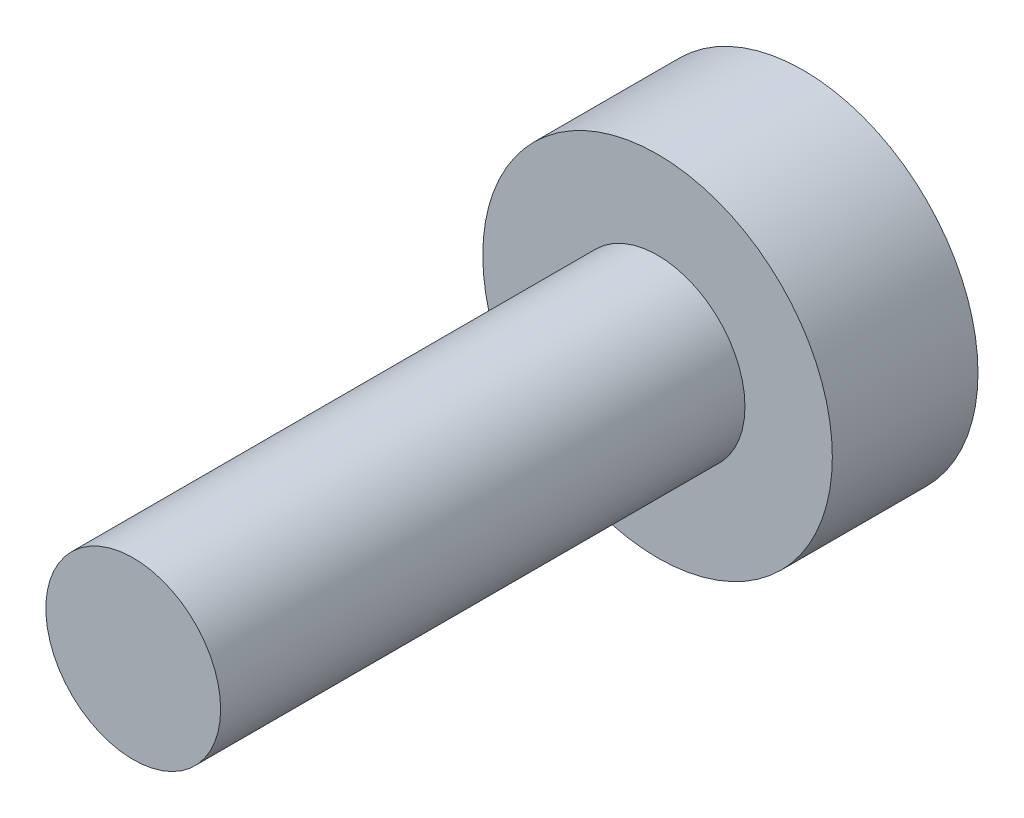
ISO-10303-21;
HEADER;
FILE_DESCRIPTION(('STEP AP214'),'2;1');
FILE_NAME('part.step','',(''),(''),'','','');
FILE_SCHEMA(('AUTOMOTIVE_DESIGN { 1 0 10303 214 1 1 1 1 }'));
ENDSEC;
DATA;
#1=APPLICATION_CONTEXT('core data for automotive mechanical design processes');
#2=APPLICATION_PROTOCOL_DEFINITION('international standard','automotive_design',2000,#1);
#3=PRODUCT_CONTEXT('',#1,'mechanical');
#4=PRODUCT('Part','Part','',(#3));
#5=PRODUCT_RELATED_PRODUCT_CATEGORY('part','',(#4));
#6=PRODUCT_DEFINITION_FORMATION('','',#4);
#7=PRODUCT_DEFINITION_CONTEXT('part definition',#1,'design');
#8=PRODUCT_DEFINITION('design','',#6,#7);
#9=PRODUCT_DEFINITION_SHAPE('','',#8);
#10=(LENGTH_UNIT() NAMED_UNIT(*) SI_UNIT(.MILLI.,.METRE.));
#11=(NAMED_UNIT(*) PLANE_ANGLE_UNIT() SI_UNIT($,.RADIAN.));
#12=(NAMED_UNIT(*) SI_UNIT($,.STERADIAN.) SOLID_ANGLE_UNIT());
#13=UNCERTAINTY_MEASURE_WITH_UNIT(LENGTH_MEASURE(1.E-05),#10,'distance_accuracy_value','');
#14=(GEOMETRIC_REPRESENTATION_CONTEXT(3) GLOBAL_UNCERTAINTY_ASSIGNED_CONTEXT((#13)) GLOBAL_UNIT_ASSIGNED_CONTEXT((#10,
#11,#12)) REPRESENTATION_CONTEXT('',''));
#15=CARTESIAN_POINT('',(0.,0.,0.));
#16=DIRECTION('',(0.,0.,1.));
#17=DIRECTION('',(1.,0.,0.));
#18=AXIS2_PLACEMENT_3D('',#15,#16,#17);
#19=CARTESIAN_POINT('',(-5.94411211869931,3.00621762325022,9.));
#20=DIRECTION('',(0.,0.,-1.));
#21=DIRECTION('',(-1.,0.,0.));
#22=AXIS2_PLACEMENT_3D('',#19,#20,#21);
#23=CYLINDRICAL_SURFACE('',#22,1.5);
#24=CARTESIAN_POINT('',(-5.94411211869931,3.00621762325022,9.));
#25=DIRECTION('',(0.,0.,1.));
#26=DIRECTION('',(1.,0.,0.));
#27=AXIS2_PLACEMENT_3D('',#24,#25,#26);
#28=CIRCLE('',#27,1.5);
#29=CARTESIAN_POINT('',(-4.44411211869931,3.00621762325022,9.));
#30=VERTEX_POINT('',#29);
#31=EDGE_CURVE('E11',#30,#30,#28,.T.);
#32=ORIENTED_EDGE('',*,*,#31,.F.);
#33=EDGE_LOOP('',(#32));
#34=FACE_BOUND('',#33,.T.);
#35=CARTESIAN_POINT('',(-5.94411211869931,3.00621762325022,0.));
#36=DIRECTION('',(0.,0.,1.));
#37=DIRECTION('',(1.,0.,0.));
#38=AXIS2_PLACEMENT_3D('',#35,#36,#37);
#39=CIRCLE('',#38,1.5);
#40=CARTESIAN_POINT('',(-4.44411211869931,3.00621762325022,0.));
#41=VERTEX_POINT('',#40);
#42=EDGE_CURVE('E44',#41,#41,#39,.T.);
#43=ORIENTED_EDGE('',*,*,#42,.T.);
#44=EDGE_LOOP('',(#43));
#45=FACE_BOUND('',#44,.T.);
#46=ADVANCED_FACE('F41',(#34,#45),#23,.T.);
#47=CARTESIAN_POINT('',(-5.94411211869931,3.00621762325022,9.));
#48=DIRECTION('',(0.,0.,1.));
#49=DIRECTION('',(1.,0.,0.));
#50=AXIS2_PLACEMENT_3D('',#47,#48,#49);
#51=PLANE('',#50);
#52=ORIENTED_EDGE('',*,*,#31,.T.);
#53=EDGE_LOOP('',(#52));
#54=FACE_BOUND('',#53,.T.);
#55=ADVANCED_FACE('F267',(#54),#51,.T.);
#56=CARTESIAN_POINT('',(-5.94411211869931,3.00621762325022,-2.5));
#57=DIRECTION('',(0.,0.,1.));
#58=DIRECTION('',(1.,0.,0.));
#59=AXIS2_PLACEMENT_3D('',#56,#57,#58);
#60=CYLINDRICAL_SURFACE('',#59,3.);
#61=CARTESIAN_POINT('',(-5.94411211869931,3.00621762325022,-2.5));
#62=DIRECTION('',(0.,0.,-1.));
#63=DIRECTION('',(-1.,0.,0.));
#64=AXIS2_PLACEMENT_3D('',#61,#62,#63);
#65=CIRCLE('',#64,3.);
#66=CARTESIAN_POINT('',(-8.94411211869931,3.00621762325022,-2.5));
#67=VERTEX_POINT('',#66);
#68=EDGE_CURVE('E240',#67,#67,#65,.T.);
#69=ORIENTED_EDGE('',*,*,#68,.F.);
#70=EDGE_LOOP('',(#69));
#71=FACE_BOUND('',#70,.T.);
#72=CARTESIAN_POINT('',(-5.94411211869931,3.00621762325022,0.));
#73=DIRECTION('',(0.,0.,-1.));
#74=DIRECTION('',(-1.,0.,0.));
#75=AXIS2_PLACEMENT_3D('',#72,#73,#74);
#76=CIRCLE('',#75,3.);
#77=CARTESIAN_POINT('',(-8.94411211869931,3.00621762325022,0.));
#78=VERTEX_POINT('',#77);
#79=EDGE_CURVE('E212',#78,#78,#76,.T.);
#80=ORIENTED_EDGE('',*,*,#79,.T.);
#81=EDGE_LOOP('',(#80));
#82=FACE_BOUND('',#81,.T.);
#83=ADVANCED_FACE('F248',(#71,#82),#60,.T.);
#84=CARTESIAN_POINT('',(-5.94411211869931,3.00621762325022,-2.5));
#85=DIRECTION('',(0.,0.,-1.));
#86=DIRECTION('',(-1.,0.,0.));
#87=AXIS2_PLACEMENT_3D('',#84,#85,#86);
#88=PLANE('',#87);
#89=DIRECTION('',(0.,-1.,0.));
#90=VECTOR('',#89,1.);
#91=CARTESIAN_POINT('',(-3.94411211869931,3.25621762325022,-2.5));
#92=LINE('',#91,#90);
#93=CARTESIAN_POINT('',(-3.94411211869931,3.25621762325022,-2.5));
#94=VERTEX_POINT('',#93);
#95=CARTESIAN_POINT('',(-3.94411211869931,2.75621762325022,-2.5));
#96=VERTEX_POINT('',#95);
#97=EDGE_CURVE('E56',#94,#96,#92,.T.);
#98=ORIENTED_EDGE('',*,*,#97,.F.);
#99=DIRECTION('',(-1.,0.,0.));
#100=VECTOR('',#99,1.);
#101=CARTESIAN_POINT('',(-3.94411211869931,3.25621762325022,-2.5));
#102=LINE('',#101,#100);
#103=CARTESIAN_POINT('',(-5.6941121186993,3.25621762325022,-2.5));
#104=VERTEX_POINT('',#103);
#105=EDGE_CURVE('E205',#94,#104,#102,.T.);
#106=ORIENTED_EDGE('',*,*,#105,.T.);
#107=DIRECTION('',(0.,-1.,0.));
#108=VECTOR('',#107,1.);
#109=CARTESIAN_POINT('',(-5.69411211869928,5.00621762325021,-2.5));
#110=LINE('',#109,#108);
#111=CARTESIAN_POINT('',(-5.69411211869928,5.00621762325021,-2.5));
#112=VERTEX_POINT('',#111);
#113=EDGE_CURVE('E202',#112,#104,#110,.T.);
#114=ORIENTED_EDGE('',*,*,#113,.F.);
#115=DIRECTION('',(-1.,0.,0.));
#116=VECTOR('',#115,1.);
#117=CARTESIAN_POINT('',(-5.69411211869928,5.00621762325021,-2.5));
#118=LINE('',#117,#116);
#119=CARTESIAN_POINT('',(-6.19411211869928,5.00621762325022,-2.5));
#120=VERTEX_POINT('',#119);
#121=EDGE_CURVE('E138',#112,#120,#118,.T.);
#122=ORIENTED_EDGE('',*,*,#121,.T.);
#123=DIRECTION('',(0.,-1.,0.));
#124=VECTOR('',#123,1.);
#125=CARTESIAN_POINT('',(-6.19411211869928,5.00621762325022,-2.5));
#126=LINE('',#125,#124);
#127=CARTESIAN_POINT('',(-6.1941121186993,3.25621762325022,-2.5));
#128=VERTEX_POINT('',#127);
#129=EDGE_CURVE('E196',#120,#128,#126,.T.);
#130=ORIENTED_EDGE('',*,*,#129,.T.);
#131=DIRECTION('',(-1.,0.,0.));
#132=VECTOR('',#131,1.);
#133=CARTESIAN_POINT('',(-6.1941121186993,3.25621762325022,-2.5));
#134=LINE('',#133,#132);
#135=CARTESIAN_POINT('',(-7.94411211869931,3.25621762325022,-2.5));
#136=VERTEX_POINT('',#135);
#137=EDGE_CURVE('E192',#128,#136,#134,.T.);
#138=ORIENTED_EDGE('',*,*,#137,.T.);
#139=DIRECTION('',(0.,-1.,0.));
#140=VECTOR('',#139,1.);
#141=CARTESIAN_POINT('',(-7.94411211869931,3.25621762325022,-2.5));
#142=LINE('',#141,#140);
#143=CARTESIAN_POINT('',(-7.94411211869931,2.75621762325022,-2.5));
#144=VERTEX_POINT('',#143);
#145=EDGE_CURVE('E188',#136,#144,#142,.T.);
#146=ORIENTED_EDGE('',*,*,#145,.T.);
#147=DIRECTION('',(-1.,0.,0.));
#148=VECTOR('',#147,1.);
#149=CARTESIAN_POINT('',(-6.19411211869931,2.75621762325022,-2.5));
#150=LINE('',#149,#148);
#151=CARTESIAN_POINT('',(-6.19411211869931,2.75621762325022,-2.5));
#152=VERTEX_POINT('',#151);
#153=EDGE_CURVE('E184',#152,#144,#150,.T.);
#154=ORIENTED_EDGE('',*,*,#153,.F.);
#155=DIRECTION('',(0.,-1.,0.));
#156=VECTOR('',#155,1.);
#157=CARTESIAN_POINT('',(-6.19411211869931,2.75621762325022,-2.5));
#158=LINE('',#157,#156);
#159=CARTESIAN_POINT('',(-6.19411211869933,1.00621762325022,-2.5));
#160=VERTEX_POINT('',#159);
#161=EDGE_CURVE('E180',#152,#160,#158,.T.);
#162=ORIENTED_EDGE('',*,*,#161,.T.);
#163=DIRECTION('',(-1.,0.,0.));
#164=VECTOR('',#163,1.);
#165=CARTESIAN_POINT('',(-5.69411211869933,1.00621762325021,-2.5));
#166=LINE('',#165,#164);
#167=CARTESIAN_POINT('',(-5.69411211869933,1.00621762325021,-2.5));
#168=VERTEX_POINT('',#167);
#169=EDGE_CURVE('E176',#168,#160,#166,.T.);
#170=ORIENTED_EDGE('',*,*,#169,.F.);
#171=DIRECTION('',(0.,-1.,0.));
#172=VECTOR('',#171,1.);
#173=CARTESIAN_POINT('',(-5.69411211869931,2.75621762325022,-2.5));
#174=LINE('',#173,#172);
#175=CARTESIAN_POINT('',(-5.69411211869931,2.75621762325022,-2.5));
#176=VERTEX_POINT('',#175);
#177=EDGE_CURVE('E172',#176,#168,#174,.T.);
#178=ORIENTED_EDGE('',*,*,#177,.F.);
#179=DIRECTION('',(-1.,0.,0.));
#180=VECTOR('',#179,1.);
#181=CARTESIAN_POINT('',(-3.94411211869931,2.75621762325022,-2.5));
#182=LINE('',#181,#180);
#183=EDGE_CURVE('E168',#96,#176,#182,.T.);
#184=ORIENTED_EDGE('',*,*,#183,.F.);
#185=EDGE_LOOP('',(#98,#106,#114,#122,#130,#138,#146,#154,#162,#170,#178,#184));
#186=FACE_BOUND('',#185,.T.);
#187=ORIENTED_EDGE('',*,*,#68,.T.);
#188=EDGE_LOOP('',(#187));
#189=FACE_BOUND('',#188,.T.);
#190=ADVANCED_FACE('F253',(#186,#189),#88,.T.);
#191=CARTESIAN_POINT('',(-5.94411211869931,3.00621762325022,0.));
#192=DIRECTION('',(0.,0.,-1.));
#193=DIRECTION('',(-1.,0.,0.));
#194=AXIS2_PLACEMENT_3D('',#191,#192,#193);
#195=PLANE('',#194);
#196=ORIENTED_EDGE('',*,*,#42,.F.);
#197=EDGE_LOOP('',(#196));
#198=FACE_BOUND('',#197,.T.);
#199=ORIENTED_EDGE('',*,*,#79,.F.);
#200=EDGE_LOOP('',(#199));
#201=FACE_BOUND('',#200,.T.);
#202=ADVANCED_FACE('F250',(#198,#201),#195,.F.);
#203=CARTESIAN_POINT('',(-3.94411211869931,3.25621762325022,-1.5));
#204=DIRECTION('',(1.,0.,0.));
#205=DIRECTION('',(0.,1.,0.));
#206=AXIS2_PLACEMENT_3D('',#203,#204,#205);
#207=PLANE('',#206);
#208=ORIENTED_EDGE('',*,*,#97,.T.);
#209=DIRECTION('',(0.,0.,-1.));
#210=VECTOR('',#209,1.);
#211=CARTESIAN_POINT('',(-3.94411211869931,2.75621762325022,-1.5));
#212=LINE('',#211,#210);
#213=CARTESIAN_POINT('',(-3.94411211869931,2.75621762325022,-1.5));
#214=VERTEX_POINT('',#213);
#215=EDGE_CURVE('E104',#214,#96,#212,.T.);
#216=ORIENTED_EDGE('',*,*,#215,.F.);
#217=DIRECTION('',(0.,-1.,0.));
#218=VECTOR('',#217,1.);
#219=CARTESIAN_POINT('',(-3.94411211869931,3.25621762325022,-1.5));
#220=LINE('',#219,#218);
#221=CARTESIAN_POINT('',(-3.94411211869931,3.25621762325022,-1.5));
#222=VERTEX_POINT('',#221);
#223=EDGE_CURVE('E209',#222,#214,#220,.T.);
#224=ORIENTED_EDGE('',*,*,#223,.F.);
#225=DIRECTION('',(0.,0.,-1.));
#226=VECTOR('',#225,1.);
#227=CARTESIAN_POINT('',(-3.94411211869931,3.25621762325022,-1.5));
#228=LINE('',#227,#226);
#229=EDGE_CURVE('E64',#222,#94,#228,.T.);
#230=ORIENTED_EDGE('',*,*,#229,.T.);
#231=EDGE_LOOP('',(#208,#216,#224,#230));
#232=FACE_BOUND('',#231,.T.);
#233=ADVANCED_FACE('F252',(#232),#207,.F.);
#234=CARTESIAN_POINT('',(-3.94411211869931,3.25621762325022,-1.5));
#235=DIRECTION('',(0.,-1.,0.));
#236=DIRECTION('',(0.,0.,-1.));
#237=AXIS2_PLACEMENT_3D('',#234,#235,#236);
#238=PLANE('',#237);
#239=ORIENTED_EDGE('',*,*,#105,.F.);
#240=ORIENTED_EDGE('',*,*,#229,.F.);
#241=DIRECTION('',(-1.,0.,0.));
#242=VECTOR('',#241,1.);
#243=CARTESIAN_POINT('',(-3.94411211869931,3.25621762325022,-1.5));
#244=LINE('',#243,#242);
#245=CARTESIAN_POINT('',(-5.6941121186993,3.25621762325022,-1.5));
#246=VERTEX_POINT('',#245);
#247=EDGE_CURVE('E160',#222,#246,#244,.T.);
#248=ORIENTED_EDGE('',*,*,#247,.T.);
#249=DIRECTION('',(0.,0.,-1.));
#250=VECTOR('',#249,1.);
#251=CARTESIAN_POINT('',(-5.6941121186993,3.25621762325022,-1.5));
#252=LINE('',#251,#250);
#253=EDGE_CURVE('E144',#246,#104,#252,.T.);
#254=ORIENTED_EDGE('',*,*,#253,.T.);
#255=EDGE_LOOP('',(#239,#240,#248,#254));
#256=FACE_BOUND('',#255,.T.);
#257=ADVANCED_FACE('F260',(#256),#238,.T.);
#258=CARTESIAN_POINT('',(-5.69411211869928,5.00621762325021,-1.5));
#259=DIRECTION('',(1.,0.,0.));
#260=DIRECTION('',(0.,1.,0.));
#261=AXIS2_PLACEMENT_3D('',#258,#259,#260);
#262=PLANE('',#261);
#263=ORIENTED_EDGE('',*,*,#113,.T.);
#264=ORIENTED_EDGE('',*,*,#253,.F.);
#265=DIRECTION('',(0.,-1.,0.));
#266=VECTOR('',#265,1.);
#267=CARTESIAN_POINT('',(-5.69411211869928,5.00621762325021,-1.5));
#268=LINE('',#267,#266);
#269=CARTESIAN_POINT('',(-5.69411211869928,5.00621762325021,-1.5));
#270=VERTEX_POINT('',#269);
#271=EDGE_CURVE('E152',#270,#246,#268,.T.);
#272=ORIENTED_EDGE('',*,*,#271,.F.);
#273=DIRECTION('',(0.,0.,-1.));
#274=VECTOR('',#273,1.);
#275=CARTESIAN_POINT('',(-5.69411211869928,5.00621762325021,-1.5));
#276=LINE('',#275,#274);
#277=EDGE_CURVE('E132',#270,#112,#276,.T.);
#278=ORIENTED_EDGE('',*,*,#277,.T.);
#279=EDGE_LOOP('',(#263,#264,#272,#278));
#280=FACE_BOUND('',#279,.T.);
#281=ADVANCED_FACE('F158',(#280),#262,.F.);
#282=CARTESIAN_POINT('',(-5.69411211869928,5.00621762325021,-1.5));
#283=DIRECTION('',(0.,-1.,0.));
#284=DIRECTION('',(1.,0.,0.));
#285=AXIS2_PLACEMENT_3D('',#282,#283,#284);
#286=PLANE('',#285);
#287=ORIENTED_EDGE('',*,*,#121,.F.);
#288=ORIENTED_EDGE('',*,*,#277,.F.);
#289=DIRECTION('',(-1.,0.,0.));
#290=VECTOR('',#289,1.);
#291=CARTESIAN_POINT('',(-5.69411211869928,5.00621762325021,-1.5));
#292=LINE('',#291,#290);
#293=CARTESIAN_POINT('',(-6.19411211869928,5.00621762325022,-1.5));
#294=VERTEX_POINT('',#293);
#295=EDGE_CURVE('E135',#270,#294,#292,.T.);
#296=ORIENTED_EDGE('',*,*,#295,.T.);
#297=DIRECTION('',(0.,0.,-1.));
#298=VECTOR('',#297,1.);
#299=CARTESIAN_POINT('',(-6.19411211869928,5.00621762325022,-1.5));
#300=LINE('',#299,#298);
#301=EDGE_CURVE('E145',#294,#120,#300,.T.);
#302=ORIENTED_EDGE('',*,*,#301,.T.);
#303=EDGE_LOOP('',(#287,#288,#296,#302));
#304=FACE_BOUND('',#303,.T.);
#305=ADVANCED_FACE('F134',(#304),#286,.T.);
#306=CARTESIAN_POINT('',(-6.19411211869928,5.00621762325022,-1.5));
#307=DIRECTION('',(1.,0.,0.));
#308=DIRECTION('',(0.,1.,0.));
#309=AXIS2_PLACEMENT_3D('',#306,#307,#308);
#310=PLANE('',#309);
#311=ORIENTED_EDGE('',*,*,#129,.F.);
#312=ORIENTED_EDGE('',*,*,#301,.F.);
#313=DIRECTION('',(0.,-1.,0.));
#314=VECTOR('',#313,1.);
#315=CARTESIAN_POINT('',(-6.19411211869928,5.00621762325022,-1.5));
#316=LINE('',#315,#314);
#317=CARTESIAN_POINT('',(-6.1941121186993,3.25621762325022,-1.5));
#318=VERTEX_POINT('',#317);
#319=EDGE_CURVE('E154',#294,#318,#316,.T.);
#320=ORIENTED_EDGE('',*,*,#319,.T.);
#321=DIRECTION('',(0.,0.,-1.));
#322=VECTOR('',#321,1.);
#323=CARTESIAN_POINT('',(-6.1941121186993,3.25621762325022,-1.5));
#324=LINE('',#323,#322);
#325=EDGE_CURVE('E217',#318,#128,#324,.T.);
#326=ORIENTED_EDGE('',*,*,#325,.T.);
#327=EDGE_LOOP('',(#311,#312,#320,#326));
#328=FACE_BOUND('',#327,.T.);
#329=ADVANCED_FACE('F322',(#328),#310,.T.);
#330=CARTESIAN_POINT('',(-6.1941121186993,3.25621762325022,-1.5));
#331=DIRECTION('',(0.,-1.,0.));
#332=DIRECTION('',(0.,0.,-1.));
#333=AXIS2_PLACEMENT_3D('',#330,#331,#332);
#334=PLANE('',#333);
#335=ORIENTED_EDGE('',*,*,#137,.F.);
#336=ORIENTED_EDGE('',*,*,#325,.F.);
#337=DIRECTION('',(-1.,0.,0.));
#338=VECTOR('',#337,1.);
#339=CARTESIAN_POINT('',(-6.1941121186993,3.25621762325022,-1.5));
#340=LINE('',#339,#338);
#341=CARTESIAN_POINT('',(-7.94411211869931,3.25621762325022,-1.5));
#342=VERTEX_POINT('',#341);
#343=EDGE_CURVE('E443',#318,#342,#340,.T.);
#344=ORIENTED_EDGE('',*,*,#343,.T.);
#345=DIRECTION('',(0.,0.,-1.));
#346=VECTOR('',#345,1.);
#347=CARTESIAN_POINT('',(-7.94411211869931,3.25621762325022,-1.5));
#348=LINE('',#347,#346);
#349=EDGE_CURVE('E220',#342,#136,#348,.T.);
#350=ORIENTED_EDGE('',*,*,#349,.T.);
#351=EDGE_LOOP('',(#335,#336,#344,#350));
#352=FACE_BOUND('',#351,.T.);
#353=ADVANCED_FACE('F331',(#352),#334,.T.);
#354=CARTESIAN_POINT('',(-7.94411211869931,3.25621762325022,-1.5));
#355=DIRECTION('',(1.,0.,0.));
#356=DIRECTION('',(0.,0.,-1.));
#357=AXIS2_PLACEMENT_3D('',#354,#355,#356);
#358=PLANE('',#357);
#359=ORIENTED_EDGE('',*,*,#145,.F.);
#360=ORIENTED_EDGE('',*,*,#349,.F.);
#361=DIRECTION('',(0.,-1.,0.));
#362=VECTOR('',#361,1.);
#363=CARTESIAN_POINT('',(-7.94411211869931,3.25621762325022,-1.5));
#364=LINE('',#363,#362);
#365=CARTESIAN_POINT('',(-7.94411211869931,2.75621762325022,-1.5));
#366=VERTEX_POINT('',#365);
#367=EDGE_CURVE('E440',#342,#366,#364,.T.);
#368=ORIENTED_EDGE('',*,*,#367,.T.);
#369=DIRECTION('',(0.,0.,-1.));
#370=VECTOR('',#369,1.);
#371=CARTESIAN_POINT('',(-7.94411211869931,2.75621762325022,-1.5));
#372=LINE('',#371,#370);
#373=EDGE_CURVE('E223',#366,#144,#372,.T.);
#374=ORIENTED_EDGE('',*,*,#373,.T.);
#375=EDGE_LOOP('',(#359,#360,#368,#374));
#376=FACE_BOUND('',#375,.T.);
#377=ADVANCED_FACE('F341',(#376),#358,.T.);
#378=CARTESIAN_POINT('',(-6.19411211869931,2.75621762325022,-1.5));
#379=DIRECTION('',(0.,-1.,0.));
#380=DIRECTION('',(0.,0.,-1.));
#381=AXIS2_PLACEMENT_3D('',#378,#379,#380);
#382=PLANE('',#381);
#383=ORIENTED_EDGE('',*,*,#153,.T.);
#384=ORIENTED_EDGE('',*,*,#373,.F.);
#385=DIRECTION('',(-1.,0.,0.));
#386=VECTOR('',#385,1.);
#387=CARTESIAN_POINT('',(-6.19411211869931,2.75621762325022,-1.5));
#388=LINE('',#387,#386);
#389=CARTESIAN_POINT('',(-6.19411211869931,2.75621762325022,-1.5));
#390=VERTEX_POINT('',#389);
#391=EDGE_CURVE('E436',#390,#366,#388,.T.);
#392=ORIENTED_EDGE('',*,*,#391,.F.);
#393=DIRECTION('',(0.,0.,-1.));
#394=VECTOR('',#393,1.);
#395=CARTESIAN_POINT('',(-6.19411211869931,2.75621762325022,-1.5));
#396=LINE('',#395,#394);
#397=EDGE_CURVE('E226',#390,#152,#396,.T.);
#398=ORIENTED_EDGE('',*,*,#397,.T.);
#399=EDGE_LOOP('',(#383,#384,#392,#398));
#400=FACE_BOUND('',#399,.T.);
#401=ADVANCED_FACE('F351',(#400),#382,.F.);
#402=CARTESIAN_POINT('',(-6.19411211869931,2.75621762325022,-1.5));
#403=DIRECTION('',(1.,0.,0.));
#404=DIRECTION('',(0.,1.,0.));
#405=AXIS2_PLACEMENT_3D('',#402,#403,#404);
#406=PLANE('',#405);
#407=ORIENTED_EDGE('',*,*,#161,.F.);
#408=ORIENTED_EDGE('',*,*,#397,.F.);
#409=DIRECTION('',(0.,-1.,0.));
#410=VECTOR('',#409,1.);
#411=CARTESIAN_POINT('',(-6.19411211869931,2.75621762325022,-1.5));
#412=LINE('',#411,#410);
#413=CARTESIAN_POINT('',(-6.19411211869933,1.00621762325022,-1.5));
#414=VERTEX_POINT('',#413);
#415=EDGE_CURVE('E433',#390,#414,#412,.T.);
#416=ORIENTED_EDGE('',*,*,#415,.T.);
#417=DIRECTION('',(0.,0.,-1.));
#418=VECTOR('',#417,1.);
#419=CARTESIAN_POINT('',(-6.19411211869933,1.00621762325022,-1.5));
#420=LINE('',#419,#418);
#421=EDGE_CURVE('E229',#414,#160,#420,.T.);
#422=ORIENTED_EDGE('',*,*,#421,.T.);
#423=EDGE_LOOP('',(#407,#408,#416,#422));
#424=FACE_BOUND('',#423,.T.);
#425=ADVANCED_FACE('F361',(#424),#406,.T.);
#426=CARTESIAN_POINT('',(-5.69411211869933,1.00621762325021,-1.5));
#427=DIRECTION('',(0.,-1.,0.));
#428=DIRECTION('',(1.,0.,0.));
#429=AXIS2_PLACEMENT_3D('',#426,#427,#428);
#430=PLANE('',#429);
#431=ORIENTED_EDGE('',*,*,#169,.T.);
#432=ORIENTED_EDGE('',*,*,#421,.F.);
#433=DIRECTION('',(-1.,0.,0.));
#434=VECTOR('',#433,1.);
#435=CARTESIAN_POINT('',(-5.69411211869933,1.00621762325021,-1.5));
#436=LINE('',#435,#434);
#437=CARTESIAN_POINT('',(-5.69411211869933,1.00621762325021,-1.5));
#438=VERTEX_POINT('',#437);
#439=EDGE_CURVE('E423',#438,#414,#436,.T.);
#440=ORIENTED_EDGE('',*,*,#439,.F.);
#441=DIRECTION('',(0.,0.,-1.));
#442=VECTOR('',#441,1.);
#443=CARTESIAN_POINT('',(-5.69411211869933,1.00621762325021,-1.5));
#444=LINE('',#443,#442);
#445=EDGE_CURVE('E232',#438,#168,#444,.T.);
#446=ORIENTED_EDGE('',*,*,#445,.T.);
#447=EDGE_LOOP('',(#431,#432,#440,#446));
#448=FACE_BOUND('',#447,.T.);
#449=ADVANCED_FACE('F371',(#448),#430,.F.);
#450=CARTESIAN_POINT('',(-5.69411211869931,2.75621762325022,-1.5));
#451=DIRECTION('',(1.,0.,0.));
#452=DIRECTION('',(0.,1.,0.));
#453=AXIS2_PLACEMENT_3D('',#450,#451,#452);
#454=PLANE('',#453);
#455=ORIENTED_EDGE('',*,*,#177,.T.);
#456=ORIENTED_EDGE('',*,*,#445,.F.);
#457=DIRECTION('',(0.,-1.,0.));
#458=VECTOR('',#457,1.);
#459=CARTESIAN_POINT('',(-5.69411211869931,2.75621762325022,-1.5));
#460=LINE('',#459,#458);
#461=CARTESIAN_POINT('',(-5.69411211869931,2.75621762325022,-1.5));
#462=VERTEX_POINT('',#461);
#463=EDGE_CURVE('E419',#462,#438,#460,.T.);
#464=ORIENTED_EDGE('',*,*,#463,.F.);
#465=DIRECTION('',(0.,0.,-1.));
#466=VECTOR('',#465,1.);
#467=CARTESIAN_POINT('',(-5.69411211869931,2.75621762325022,-1.5));
#468=LINE('',#467,#466);
#469=EDGE_CURVE('E235',#462,#176,#468,.T.);
#470=ORIENTED_EDGE('',*,*,#469,.T.);
#471=EDGE_LOOP('',(#455,#456,#464,#470));
#472=FACE_BOUND('',#471,.T.);
#473=ADVANCED_FACE('F381',(#472),#454,.F.);
#474=CARTESIAN_POINT('',(-3.94411211869931,2.75621762325022,-1.5));
#475=DIRECTION('',(0.,-1.,0.));
#476=DIRECTION('',(0.,0.,-1.));
#477=AXIS2_PLACEMENT_3D('',#474,#475,#476);
#478=PLANE('',#477);
#479=ORIENTED_EDGE('',*,*,#183,.T.);
#480=ORIENTED_EDGE('',*,*,#469,.F.);
#481=DIRECTION('',(-1.,0.,0.));
#482=VECTOR('',#481,1.);
#483=CARTESIAN_POINT('',(-3.94411211869931,2.75621762325022,-1.5));
#484=LINE('',#483,#482);
#485=EDGE_CURVE('E424',#214,#462,#484,.T.);
#486=ORIENTED_EDGE('',*,*,#485,.F.);
#487=ORIENTED_EDGE('',*,*,#215,.T.);
#488=EDGE_LOOP('',(#479,#480,#486,#487));
#489=FACE_BOUND('',#488,.T.);
#490=ADVANCED_FACE('F391',(#489),#478,.F.);
#491=CARTESIAN_POINT('',(0.,0.,-1.5));
#492=DIRECTION('',(0.,0.,-1.));
#493=DIRECTION('',(-1.,0.,0.));
#494=AXIS2_PLACEMENT_3D('',#491,#492,#493);
#495=PLANE('',#494);
#496=ORIENTED_EDGE('',*,*,#223,.T.);
#497=ORIENTED_EDGE('',*,*,#485,.T.);
#498=ORIENTED_EDGE('',*,*,#463,.T.);
#499=ORIENTED_EDGE('',*,*,#439,.T.);
#500=ORIENTED_EDGE('',*,*,#415,.F.);
#501=ORIENTED_EDGE('',*,*,#391,.T.);
#502=ORIENTED_EDGE('',*,*,#367,.F.);
#503=ORIENTED_EDGE('',*,*,#343,.F.);
#504=ORIENTED_EDGE('',*,*,#319,.F.);
#505=ORIENTED_EDGE('',*,*,#295,.F.);
#506=ORIENTED_EDGE('',*,*,#271,.T.);
#507=ORIENTED_EDGE('',*,*,#247,.F.);
#508=EDGE_LOOP('',(#496,#497,#498,#499,#500,#501,#502,#503,#504,#505,#506,#507));
#509=FACE_BOUND('',#508,.T.);
#510=ADVANCED_FACE('F151',(#509),#495,.T.);
#511=CLOSED_SHELL('',(#46,#55,#83,#190,#202,#233,#257,#281,#305,#329,#353,#377,#401,#425,#449,
#473,#490,#510));
#512=MANIFOLD_SOLID_BREP('B2',#511);
#513=ADVANCED_BREP_SHAPE_REPRESENTATION('',(#18,#512),#14);
#514=SHAPE_DEFINITION_REPRESENTATION(#9,#513);
ENDSEC;
END-ISO-10303-21;
